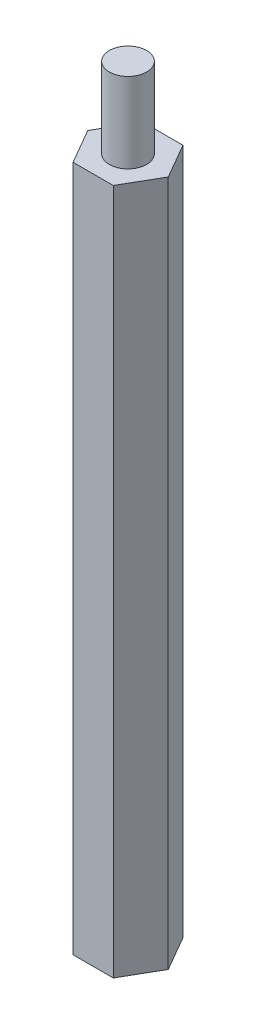
ISO-10303-21;
HEADER;
FILE_DESCRIPTION(('STEP AP214'),'2;1');
FILE_NAME('part.step','',(''),(''),'','','');
FILE_SCHEMA(('AUTOMOTIVE_DESIGN { 1 0 10303 214 1 1 1 1 }'));
ENDSEC;
DATA;
#1=APPLICATION_CONTEXT('core data for automotive mechanical design processes');
#2=APPLICATION_PROTOCOL_DEFINITION('international standard','automotive_design',2000,#1);
#3=PRODUCT_CONTEXT('',#1,'mechanical');
#4=PRODUCT('Part','Part','',(#3));
#5=PRODUCT_RELATED_PRODUCT_CATEGORY('part','',(#4));
#6=PRODUCT_DEFINITION_FORMATION('','',#4);
#7=PRODUCT_DEFINITION_CONTEXT('part definition',#1,'design');
#8=PRODUCT_DEFINITION('design','',#6,#7);
#9=PRODUCT_DEFINITION_SHAPE('','',#8);
#10=(LENGTH_UNIT() NAMED_UNIT(*) SI_UNIT(.MILLI.,.METRE.));
#11=(NAMED_UNIT(*) PLANE_ANGLE_UNIT() SI_UNIT($,.RADIAN.));
#12=(NAMED_UNIT(*) SI_UNIT($,.STERADIAN.) SOLID_ANGLE_UNIT());
#13=UNCERTAINTY_MEASURE_WITH_UNIT(LENGTH_MEASURE(1.E-05),#10,'distance_accuracy_value','');
#14=(GEOMETRIC_REPRESENTATION_CONTEXT(3) GLOBAL_UNCERTAINTY_ASSIGNED_CONTEXT((#13)) GLOBAL_UNIT_ASSIGNED_CONTEXT((#10,
#11,#12)) REPRESENTATION_CONTEXT('',''));
#15=CARTESIAN_POINT('',(0.,0.,0.));
#16=DIRECTION('',(0.,0.,1.));
#17=DIRECTION('',(1.,0.,0.));
#18=AXIS2_PLACEMENT_3D('',#15,#16,#17);
#19=CARTESIAN_POINT('',(0.,50.038,0.));
#20=DIRECTION('',(0.,1.,0.));
#21=DIRECTION('',(0.,0.,1.));
#22=AXIS2_PLACEMENT_3D('',#19,#20,#21);
#23=PLANE('',#22);
#24=DIRECTION('',(0.5,0.,-0.866025403784439));
#25=VECTOR('',#24,1.);
#26=CARTESIAN_POINT('',(1.46646968374165,50.038,2.54));
#27=LINE('',#26,#25);
#28=CARTESIAN_POINT('',(1.46646968374165,50.038,2.54));
#29=VERTEX_POINT('',#28);
#30=CARTESIAN_POINT('',(2.9329393674833,50.038,0.));
#31=VERTEX_POINT('',#30);
#32=EDGE_CURVE('E131',#29,#31,#27,.T.);
#33=ORIENTED_EDGE('',*,*,#32,.T.);
#34=DIRECTION('',(-0.5,0.,-0.866025403784439));
#35=VECTOR('',#34,1.);
#36=CARTESIAN_POINT('',(2.9329393674833,50.038,0.));
#37=LINE('',#36,#35);
#38=CARTESIAN_POINT('',(1.46646968374165,50.038,-2.54));
#39=VERTEX_POINT('',#38);
#40=EDGE_CURVE('E89',#31,#39,#37,.T.);
#41=ORIENTED_EDGE('',*,*,#40,.T.);
#42=DIRECTION('',(-1.,0.,0.));
#43=VECTOR('',#42,1.);
#44=CARTESIAN_POINT('',(1.46646968374165,50.038,-2.54));
#45=LINE('',#44,#43);
#46=CARTESIAN_POINT('',(-1.46646968374165,50.038,-2.54));
#47=VERTEX_POINT('',#46);
#48=EDGE_CURVE('E102',#39,#47,#45,.T.);
#49=ORIENTED_EDGE('',*,*,#48,.T.);
#50=DIRECTION('',(-0.5,0.,0.866025403784439));
#51=VECTOR('',#50,1.);
#52=CARTESIAN_POINT('',(-1.46646968374165,50.038,-2.54));
#53=LINE('',#52,#51);
#54=CARTESIAN_POINT('',(-2.9329393674833,50.038,0.));
#55=VERTEX_POINT('',#54);
#56=EDGE_CURVE('E96',#47,#55,#53,.T.);
#57=ORIENTED_EDGE('',*,*,#56,.T.);
#58=DIRECTION('',(0.5,0.,0.866025403784439));
#59=VECTOR('',#58,1.);
#60=CARTESIAN_POINT('',(-2.9329393674833,50.038,0.));
#61=LINE('',#60,#59);
#62=CARTESIAN_POINT('',(-1.46646968374165,50.038,2.54));
#63=VERTEX_POINT('',#62);
#64=EDGE_CURVE('E100',#55,#63,#61,.T.);
#65=ORIENTED_EDGE('',*,*,#64,.T.);
#66=DIRECTION('',(1.,0.,0.));
#67=VECTOR('',#66,1.);
#68=CARTESIAN_POINT('',(-1.46646968374165,50.038,2.54));
#69=LINE('',#68,#67);
#70=EDGE_CURVE('E52',#63,#29,#69,.T.);
#71=ORIENTED_EDGE('',*,*,#70,.T.);
#72=EDGE_LOOP('',(#33,#41,#49,#57,#65,#71));
#73=FACE_BOUND('',#72,.T.);
#74=CARTESIAN_POINT('',(0.,50.038,0.));
#75=DIRECTION('',(0.,1.,0.));
#76=DIRECTION('',(0.,0.,1.));
#77=AXIS2_PLACEMENT_3D('',#74,#75,#76);
#78=CIRCLE('',#77,1.3589);
#79=CARTESIAN_POINT('',(0.,50.038,1.35890000000001));
#80=VERTEX_POINT('',#79);
#81=EDGE_CURVE('E184',#80,#80,#78,.T.);
#82=ORIENTED_EDGE('',*,*,#81,.F.);
#83=EDGE_LOOP('',(#82));
#84=FACE_BOUND('',#83,.T.);
#85=ADVANCED_FACE('F35',(#73,#84),#23,.T.);
#86=CARTESIAN_POINT('',(1.46646968374165,50.038,2.54));
#87=DIRECTION('',(-0.866025403784439,0.,-0.5));
#88=DIRECTION('',(-0.5,0.,0.866025403784439));
#89=AXIS2_PLACEMENT_3D('',#86,#87,#88);
#90=PLANE('',#89);
#91=DIRECTION('',(0.5,0.,-0.866025403784439));
#92=VECTOR('',#91,1.);
#93=CARTESIAN_POINT('',(1.46646968374165,0.,2.54));
#94=LINE('',#93,#92);
#95=CARTESIAN_POINT('',(1.46646968374165,0.,2.54));
#96=VERTEX_POINT('',#95);
#97=CARTESIAN_POINT('',(2.9329393674833,0.,0.));
#98=VERTEX_POINT('',#97);
#99=EDGE_CURVE('E120',#96,#98,#94,.T.);
#100=ORIENTED_EDGE('',*,*,#99,.T.);
#101=DIRECTION('',(0.,-1.,0.));
#102=VECTOR('',#101,1.);
#103=CARTESIAN_POINT('',(2.9329393674833,50.038,0.));
#104=LINE('',#103,#102);
#105=EDGE_CURVE('E11',#31,#98,#104,.T.);
#106=ORIENTED_EDGE('',*,*,#105,.F.);
#107=ORIENTED_EDGE('',*,*,#32,.F.);
#108=DIRECTION('',(0.,-1.,0.));
#109=VECTOR('',#108,1.);
#110=CARTESIAN_POINT('',(1.46646968374165,50.038,2.54));
#111=LINE('',#110,#109);
#112=EDGE_CURVE('E116',#29,#96,#111,.T.);
#113=ORIENTED_EDGE('',*,*,#112,.T.);
#114=EDGE_LOOP('',(#100,#106,#107,#113));
#115=FACE_BOUND('',#114,.T.);
#116=ADVANCED_FACE('F37',(#115),#90,.F.);
#117=CARTESIAN_POINT('',(2.9329393674833,50.038,0.));
#118=DIRECTION('',(-0.866025403784439,0.,0.5));
#119=DIRECTION('',(0.5,0.,0.866025403784439));
#120=AXIS2_PLACEMENT_3D('',#117,#118,#119);
#121=PLANE('',#120);
#122=DIRECTION('',(-0.5,0.,-0.866025403784439));
#123=VECTOR('',#122,1.);
#124=CARTESIAN_POINT('',(2.9329393674833,0.,0.));
#125=LINE('',#124,#123);
#126=CARTESIAN_POINT('',(1.46646968374165,0.,-2.54));
#127=VERTEX_POINT('',#126);
#128=EDGE_CURVE('E123',#98,#127,#125,.T.);
#129=ORIENTED_EDGE('',*,*,#128,.T.);
#130=DIRECTION('',(0.,-1.,0.));
#131=VECTOR('',#130,1.);
#132=CARTESIAN_POINT('',(1.46646968374165,50.038,-2.54));
#133=LINE('',#132,#131);
#134=EDGE_CURVE('E44',#39,#127,#133,.T.);
#135=ORIENTED_EDGE('',*,*,#134,.F.);
#136=ORIENTED_EDGE('',*,*,#40,.F.);
#137=ORIENTED_EDGE('',*,*,#105,.T.);
#138=EDGE_LOOP('',(#129,#135,#136,#137));
#139=FACE_BOUND('',#138,.T.);
#140=ADVANCED_FACE('F163',(#139),#121,.F.);
#141=CARTESIAN_POINT('',(1.46646968374165,50.038,-2.54));
#142=DIRECTION('',(0.,0.,1.));
#143=DIRECTION('',(1.,0.,0.));
#144=AXIS2_PLACEMENT_3D('',#141,#142,#143);
#145=PLANE('',#144);
#146=DIRECTION('',(-1.,0.,0.));
#147=VECTOR('',#146,1.);
#148=CARTESIAN_POINT('',(1.46646968374165,0.,-2.54));
#149=LINE('',#148,#147);
#150=CARTESIAN_POINT('',(-1.46646968374165,0.,-2.54));
#151=VERTEX_POINT('',#150);
#152=EDGE_CURVE('E126',#127,#151,#149,.T.);
#153=ORIENTED_EDGE('',*,*,#152,.T.);
#154=DIRECTION('',(0.,-1.,0.));
#155=VECTOR('',#154,1.);
#156=CARTESIAN_POINT('',(-1.46646968374165,50.038,-2.54));
#157=LINE('',#156,#155);
#158=EDGE_CURVE('E111',#47,#151,#157,.T.);
#159=ORIENTED_EDGE('',*,*,#158,.F.);
#160=ORIENTED_EDGE('',*,*,#48,.F.);
#161=ORIENTED_EDGE('',*,*,#134,.T.);
#162=EDGE_LOOP('',(#153,#159,#160,#161));
#163=FACE_BOUND('',#162,.T.);
#164=ADVANCED_FACE('F138',(#163),#145,.F.);
#165=CARTESIAN_POINT('',(-1.46646968374165,50.038,-2.54));
#166=DIRECTION('',(0.866025403784439,0.,0.5));
#167=DIRECTION('',(0.5,0.,-0.866025403784439));
#168=AXIS2_PLACEMENT_3D('',#165,#166,#167);
#169=PLANE('',#168);
#170=DIRECTION('',(-0.5,0.,0.866025403784439));
#171=VECTOR('',#170,1.);
#172=CARTESIAN_POINT('',(-1.46646968374165,0.,-2.54));
#173=LINE('',#172,#171);
#174=CARTESIAN_POINT('',(-2.9329393674833,0.,0.));
#175=VERTEX_POINT('',#174);
#176=EDGE_CURVE('E110',#151,#175,#173,.T.);
#177=ORIENTED_EDGE('',*,*,#176,.T.);
#178=DIRECTION('',(0.,-1.,0.));
#179=VECTOR('',#178,1.);
#180=CARTESIAN_POINT('',(-2.9329393674833,50.038,0.));
#181=LINE('',#180,#179);
#182=EDGE_CURVE('E107',#55,#175,#181,.T.);
#183=ORIENTED_EDGE('',*,*,#182,.F.);
#184=ORIENTED_EDGE('',*,*,#56,.F.);
#185=ORIENTED_EDGE('',*,*,#158,.T.);
#186=EDGE_LOOP('',(#177,#183,#184,#185));
#187=FACE_BOUND('',#186,.T.);
#188=ADVANCED_FACE('F108',(#187),#169,.F.);
#189=CARTESIAN_POINT('',(-2.9329393674833,50.038,0.));
#190=DIRECTION('',(0.866025403784439,0.,-0.5));
#191=DIRECTION('',(-0.5,0.,-0.866025403784439));
#192=AXIS2_PLACEMENT_3D('',#189,#190,#191);
#193=PLANE('',#192);
#194=DIRECTION('',(0.5,0.,0.866025403784439));
#195=VECTOR('',#194,1.);
#196=CARTESIAN_POINT('',(-2.9329393674833,0.,0.));
#197=LINE('',#196,#195);
#198=CARTESIAN_POINT('',(-1.46646968374165,0.,2.54));
#199=VERTEX_POINT('',#198);
#200=EDGE_CURVE('E75',#175,#199,#197,.T.);
#201=ORIENTED_EDGE('',*,*,#200,.T.);
#202=DIRECTION('',(0.,-1.,0.));
#203=VECTOR('',#202,1.);
#204=CARTESIAN_POINT('',(-1.46646968374165,50.038,2.54));
#205=LINE('',#204,#203);
#206=EDGE_CURVE('E112',#63,#199,#205,.T.);
#207=ORIENTED_EDGE('',*,*,#206,.F.);
#208=ORIENTED_EDGE('',*,*,#64,.F.);
#209=ORIENTED_EDGE('',*,*,#182,.T.);
#210=EDGE_LOOP('',(#201,#207,#208,#209));
#211=FACE_BOUND('',#210,.T.);
#212=ADVANCED_FACE('F114',(#211),#193,.F.);
#213=CARTESIAN_POINT('',(-1.46646968374165,50.038,2.54));
#214=DIRECTION('',(0.,0.,-1.));
#215=DIRECTION('',(-1.,0.,0.));
#216=AXIS2_PLACEMENT_3D('',#213,#214,#215);
#217=PLANE('',#216);
#218=DIRECTION('',(1.,0.,0.));
#219=VECTOR('',#218,1.);
#220=CARTESIAN_POINT('',(-1.46646968374165,0.,2.54));
#221=LINE('',#220,#219);
#222=EDGE_CURVE('E81',#199,#96,#221,.T.);
#223=ORIENTED_EDGE('',*,*,#222,.T.);
#224=ORIENTED_EDGE('',*,*,#112,.F.);
#225=ORIENTED_EDGE('',*,*,#70,.F.);
#226=ORIENTED_EDGE('',*,*,#206,.T.);
#227=EDGE_LOOP('',(#223,#224,#225,#226));
#228=FACE_BOUND('',#227,.T.);
#229=ADVANCED_FACE('F145',(#228),#217,.F.);
#230=CARTESIAN_POINT('',(0.,0.,0.));
#231=DIRECTION('',(0.,1.,0.));
#232=DIRECTION('',(0.,0.,1.));
#233=AXIS2_PLACEMENT_3D('',#230,#231,#232);
#234=PLANE('',#233);
#235=CARTESIAN_POINT('',(0.,0.,0.));
#236=DIRECTION('',(0.,-1.,0.));
#237=DIRECTION('',(0.,0.,-1.));
#238=AXIS2_PLACEMENT_3D('',#235,#236,#237);
#239=CIRCLE('',#238,1.3589);
#240=CARTESIAN_POINT('',(0.,0.,-1.3589));
#241=VERTEX_POINT('',#240);
#242=EDGE_CURVE('E185',#241,#241,#239,.T.);
#243=ORIENTED_EDGE('',*,*,#242,.F.);
#244=EDGE_LOOP('',(#243));
#245=FACE_BOUND('',#244,.T.);
#246=ORIENTED_EDGE('',*,*,#99,.F.);
#247=ORIENTED_EDGE('',*,*,#222,.F.);
#248=ORIENTED_EDGE('',*,*,#200,.F.);
#249=ORIENTED_EDGE('',*,*,#176,.F.);
#250=ORIENTED_EDGE('',*,*,#152,.F.);
#251=ORIENTED_EDGE('',*,*,#128,.F.);
#252=EDGE_LOOP('',(#246,#247,#248,#249,#250,#251));
#253=FACE_BOUND('',#252,.T.);
#254=ADVANCED_FACE('F141',(#245,#253),#234,.F.);
#255=CARTESIAN_POINT('',(0.,55.88,0.));
#256=DIRECTION('',(0.,-1.,0.));
#257=DIRECTION('',(0.,0.,-1.));
#258=AXIS2_PLACEMENT_3D('',#255,#256,#257);
#259=CYLINDRICAL_SURFACE('',#258,1.3589);
#260=CARTESIAN_POINT('',(0.,55.88,0.));
#261=DIRECTION('',(0.,1.,0.));
#262=DIRECTION('',(0.,0.,1.));
#263=AXIS2_PLACEMENT_3D('',#260,#261,#262);
#264=CIRCLE('',#263,1.3589);
#265=CARTESIAN_POINT('',(0.,55.88,1.35890000000001));
#266=VERTEX_POINT('',#265);
#267=EDGE_CURVE('E124',#266,#266,#264,.T.);
#268=ORIENTED_EDGE('',*,*,#267,.F.);
#269=EDGE_LOOP('',(#268));
#270=FACE_BOUND('',#269,.T.);
#271=ORIENTED_EDGE('',*,*,#81,.T.);
#272=EDGE_LOOP('',(#271));
#273=FACE_BOUND('',#272,.T.);
#274=ADVANCED_FACE('F153',(#270,#273),#259,.T.);
#275=CARTESIAN_POINT('',(0.,55.88,0.));
#276=DIRECTION('',(0.,1.,0.));
#277=DIRECTION('',(0.,0.,1.));
#278=AXIS2_PLACEMENT_3D('',#275,#276,#277);
#279=PLANE('',#278);
#280=ORIENTED_EDGE('',*,*,#267,.T.);
#281=EDGE_LOOP('',(#280));
#282=FACE_BOUND('',#281,.T.);
#283=ADVANCED_FACE('F167',(#282),#279,.T.);
#284=CARTESIAN_POINT('',(0.,8.382,0.));
#285=DIRECTION('',(0.,-1.,0.));
#286=DIRECTION('',(0.,0.,-1.));
#287=AXIS2_PLACEMENT_3D('',#284,#285,#286);
#288=CYLINDRICAL_SURFACE('',#287,1.3589);
#289=CARTESIAN_POINT('',(0.,8.382,0.));
#290=DIRECTION('',(0.,-1.,0.));
#291=DIRECTION('',(0.,0.,-1.));
#292=AXIS2_PLACEMENT_3D('',#289,#290,#291);
#293=CIRCLE('',#292,1.3589);
#294=CARTESIAN_POINT('',(0.,8.382,-1.3589));
#295=VERTEX_POINT('',#294);
#296=EDGE_CURVE('E183',#295,#295,#293,.T.);
#297=ORIENTED_EDGE('',*,*,#296,.F.);
#298=EDGE_LOOP('',(#297));
#299=FACE_BOUND('',#298,.T.);
#300=ORIENTED_EDGE('',*,*,#242,.T.);
#301=EDGE_LOOP('',(#300));
#302=FACE_BOUND('',#301,.T.);
#303=ADVANCED_FACE('F171',(#299,#302),#288,.F.);
#304=CARTESIAN_POINT('',(0.,8.382,0.));
#305=DIRECTION('',(0.,-1.,0.));
#306=DIRECTION('',(0.,0.,-1.));
#307=AXIS2_PLACEMENT_3D('',#304,#305,#306);
#308=PLANE('',#307);
#309=ORIENTED_EDGE('',*,*,#296,.T.);
#310=EDGE_LOOP('',(#309));
#311=FACE_BOUND('',#310,.T.);
#312=ADVANCED_FACE('F175',(#311),#308,.T.);
#313=CLOSED_SHELL('',(#85,#116,#140,#164,#188,#212,#229,#254,#274,#283,#303,#312));
#314=MANIFOLD_SOLID_BREP('B2',#313);
#315=ADVANCED_BREP_SHAPE_REPRESENTATION('',(#18,#314),#14);
#316=SHAPE_DEFINITION_REPRESENTATION(#9,#315);
ENDSEC;
END-ISO-10303-21;
